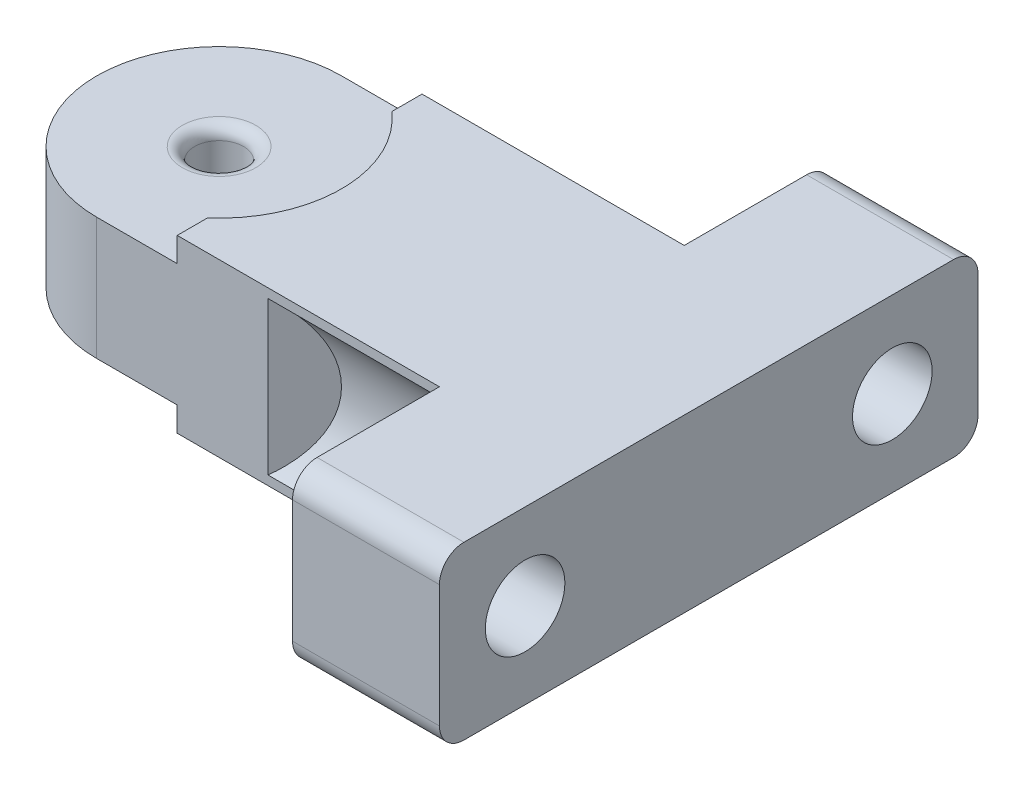
ISO-10303-21;
HEADER;
FILE_DESCRIPTION(('STEP AP214'),'2;1');
FILE_NAME('part.step','',(''),(''),'','','');
FILE_SCHEMA(('AUTOMOTIVE_DESIGN { 1 0 10303 214 1 1 1 1 }'));
ENDSEC;
DATA;
#1=APPLICATION_CONTEXT('core data for automotive mechanical design processes');
#2=APPLICATION_PROTOCOL_DEFINITION('international standard','automotive_design',2000,#1);
#3=PRODUCT_CONTEXT('',#1,'mechanical');
#4=PRODUCT('Part','Part','',(#3));
#5=PRODUCT_RELATED_PRODUCT_CATEGORY('part','',(#4));
#6=PRODUCT_DEFINITION_FORMATION('','',#4);
#7=PRODUCT_DEFINITION_CONTEXT('part definition',#1,'design');
#8=PRODUCT_DEFINITION('design','',#6,#7);
#9=PRODUCT_DEFINITION_SHAPE('','',#8);
#10=(LENGTH_UNIT() NAMED_UNIT(*) SI_UNIT(.MILLI.,.METRE.));
#11=(NAMED_UNIT(*) PLANE_ANGLE_UNIT() SI_UNIT($,.RADIAN.));
#12=(NAMED_UNIT(*) SI_UNIT($,.STERADIAN.) SOLID_ANGLE_UNIT());
#13=UNCERTAINTY_MEASURE_WITH_UNIT(LENGTH_MEASURE(1.E-05),#10,'distance_accuracy_value','');
#14=(GEOMETRIC_REPRESENTATION_CONTEXT(3) GLOBAL_UNCERTAINTY_ASSIGNED_CONTEXT((#13)) GLOBAL_UNIT_ASSIGNED_CONTEXT((#10,
#11,#12)) REPRESENTATION_CONTEXT('',''));
#15=CARTESIAN_POINT('',(0.,0.,0.));
#16=DIRECTION('',(0.,0.,1.));
#17=DIRECTION('',(1.,0.,0.));
#18=AXIS2_PLACEMENT_3D('',#15,#16,#17);
#19=CARTESIAN_POINT('',(25.,10.,10.));
#20=DIRECTION('',(0.,0.,-1.));
#21=DIRECTION('',(-1.,0.,0.));
#22=AXIS2_PLACEMENT_3D('',#19,#20,#21);
#23=PLANE('',#22);
#24=DIRECTION('',(0.,1.,0.));
#25=VECTOR('',#24,1.);
#26=CARTESIAN_POINT('',(-1.00000000000007,10.,10.));
#27=LINE('',#26,#25);
#28=CARTESIAN_POINT('',(-1.00000000000007,-1.2449979983984,10.));
#29=VERTEX_POINT('',#28);
#30=CARTESIAN_POINT('',(-1.00000000000007,11.2449979983984,10.));
#31=VERTEX_POINT('',#30);
#32=EDGE_CURVE('E418',#29,#31,#27,.T.);
#33=ORIENTED_EDGE('',*,*,#32,.T.);
#34=DIRECTION('',(1.,0.,0.));
#35=VECTOR('',#34,1.);
#36=CARTESIAN_POINT('',(3.,11.2449979983984,10.));
#37=LINE('',#36,#35);
#38=CARTESIAN_POINT('',(13.,11.2449979983984,10.));
#39=VERTEX_POINT('',#38);
#40=EDGE_CURVE('E271',#39,#31,#37,.F.);
#41=ORIENTED_EDGE('',*,*,#40,.F.);
#42=DIRECTION('',(0.,1.,0.));
#43=VECTOR('',#42,1.);
#44=CARTESIAN_POINT('',(13.,-2.,10.));
#45=LINE('',#44,#43);
#46=CARTESIAN_POINT('',(13.,12.,10.));
#47=VERTEX_POINT('',#46);
#48=EDGE_CURVE('E301',#39,#47,#45,.T.);
#49=ORIENTED_EDGE('',*,*,#48,.T.);
#50=DIRECTION('',(1.,0.,0.));
#51=VECTOR('',#50,1.);
#52=CARTESIAN_POINT('',(25.,12.,10.));
#53=LINE('',#52,#51);
#54=CARTESIAN_POINT('',(-8.42023376202405,12.,10.));
#55=VERTEX_POINT('',#54);
#56=EDGE_CURVE('E355',#55,#47,#53,.T.);
#57=ORIENTED_EDGE('',*,*,#56,.F.);
#58=DIRECTION('',(0.,-1.,0.));
#59=VECTOR('',#58,1.);
#60=CARTESIAN_POINT('',(-8.42023376202405,12.,10.));
#61=LINE('',#60,#59);
#62=CARTESIAN_POINT('',(-8.42023376202405,10.,10.));
#63=VERTEX_POINT('',#62);
#64=EDGE_CURVE('E361',#55,#63,#61,.T.);
#65=ORIENTED_EDGE('',*,*,#64,.T.);
#66=DIRECTION('',(1.,0.,0.));
#67=VECTOR('',#66,1.);
#68=CARTESIAN_POINT('',(25.,10.,10.));
#69=LINE('',#68,#67);
#70=CARTESIAN_POINT('',(-15.,10.,10.));
#71=VERTEX_POINT('',#70);
#72=EDGE_CURVE('E381',#71,#63,#69,.T.);
#73=ORIENTED_EDGE('',*,*,#72,.F.);
#74=DIRECTION('',(0.,-1.,0.));
#75=VECTOR('',#74,1.);
#76=CARTESIAN_POINT('',(-15.,10.,10.));
#77=LINE('',#76,#75);
#78=CARTESIAN_POINT('',(-15.,0.,10.));
#79=VERTEX_POINT('',#78);
#80=EDGE_CURVE('E386',#71,#79,#77,.T.);
#81=ORIENTED_EDGE('',*,*,#80,.T.);
#82=DIRECTION('',(1.,0.,0.));
#83=VECTOR('',#82,1.);
#84=CARTESIAN_POINT('',(25.,0.,10.));
#85=LINE('',#84,#83);
#86=CARTESIAN_POINT('',(-8.42023376202405,0.,10.));
#87=VERTEX_POINT('',#86);
#88=EDGE_CURVE('E387',#79,#87,#85,.T.);
#89=ORIENTED_EDGE('',*,*,#88,.T.);
#90=DIRECTION('',(0.,1.,0.));
#91=VECTOR('',#90,1.);
#92=CARTESIAN_POINT('',(-8.42023376202405,-2.,10.));
#93=LINE('',#92,#91);
#94=CARTESIAN_POINT('',(-8.42023376202405,-2.,10.));
#95=VERTEX_POINT('',#94);
#96=EDGE_CURVE('E343',#95,#87,#93,.T.);
#97=ORIENTED_EDGE('',*,*,#96,.F.);
#98=DIRECTION('',(1.,0.,0.));
#99=VECTOR('',#98,1.);
#100=CARTESIAN_POINT('',(25.,-2.,10.));
#101=LINE('',#100,#99);
#102=CARTESIAN_POINT('',(13.,-2.,10.));
#103=VERTEX_POINT('',#102);
#104=EDGE_CURVE('E318',#95,#103,#101,.T.);
#105=ORIENTED_EDGE('',*,*,#104,.T.);
#106=CARTESIAN_POINT('',(13.,-1.2449979983984,10.));
#107=VERTEX_POINT('',#106);
#108=EDGE_CURVE('E297',#103,#107,#45,.T.);
#109=ORIENTED_EDGE('',*,*,#108,.T.);
#110=DIRECTION('',(1.,0.,0.));
#111=VECTOR('',#110,1.);
#112=CARTESIAN_POINT('',(3.,-1.2449979983984,10.));
#113=LINE('',#112,#111);
#114=EDGE_CURVE('E268',#29,#107,#113,.T.);
#115=ORIENTED_EDGE('',*,*,#114,.F.);
#116=EDGE_LOOP('',(#33,#41,#49,#57,#65,#73,#81,#89,#97,#105,#109,#115));
#117=FACE_BOUND('',#116,.T.);
#118=ADVANCED_FACE('F37',(#117),#23,.F.);
#119=CARTESIAN_POINT('',(25.,10.,10.));
#120=DIRECTION('',(-1.,0.,0.));
#121=DIRECTION('',(0.,0.,1.));
#122=AXIS2_PLACEMENT_3D('',#119,#120,#121);
#123=PLANE('',#122);
#124=CARTESIAN_POINT('',(25.,5.,15.));
#125=DIRECTION('',(1.,0.,0.));
#126=DIRECTION('',(0.,0.,-1.));
#127=AXIS2_PLACEMENT_3D('',#124,#125,#126);
#128=CIRCLE('',#127,3.25);
#129=CARTESIAN_POINT('',(25.,5.,11.75));
#130=VERTEX_POINT('',#129);
#131=EDGE_CURVE('E274',#130,#130,#128,.T.);
#132=ORIENTED_EDGE('',*,*,#131,.F.);
#133=EDGE_LOOP('',(#132));
#134=FACE_BOUND('',#133,.T.);
#135=CARTESIAN_POINT('',(25.,5.,-15.));
#136=DIRECTION('',(1.,0.,0.));
#137=DIRECTION('',(0.,0.,-1.));
#138=AXIS2_PLACEMENT_3D('',#135,#136,#137);
#139=CIRCLE('',#138,3.25);
#140=CARTESIAN_POINT('',(25.,5.,-18.25));
#141=VERTEX_POINT('',#140);
#142=EDGE_CURVE('E273',#141,#141,#139,.T.);
#143=ORIENTED_EDGE('',*,*,#142,.F.);
#144=EDGE_LOOP('',(#143));
#145=FACE_BOUND('',#144,.T.);
#146=DIRECTION('',(0.,0.,-1.));
#147=VECTOR('',#146,1.);
#148=CARTESIAN_POINT('',(25.,-2.,-10.));
#149=LINE('',#148,#147);
#150=CARTESIAN_POINT('',(25.,-2.,20.));
#151=VERTEX_POINT('',#150);
#152=CARTESIAN_POINT('',(25.,-2.,-20.));
#153=VERTEX_POINT('',#152);
#154=EDGE_CURVE('E314',#151,#153,#149,.T.);
#155=ORIENTED_EDGE('',*,*,#154,.T.);
#156=CARTESIAN_POINT('',(25.,0.,-20.));
#157=DIRECTION('',(-1.,0.,0.));
#158=DIRECTION('',(0.,0.,1.));
#159=AXIS2_PLACEMENT_3D('',#156,#157,#158);
#160=CIRCLE('',#159,2.);
#161=CARTESIAN_POINT('',(25.,0.,-22.));
#162=VERTEX_POINT('',#161);
#163=EDGE_CURVE('E445',#153,#162,#160,.F.);
#164=ORIENTED_EDGE('',*,*,#163,.T.);
#165=DIRECTION('',(0.,1.,0.));
#166=VECTOR('',#165,1.);
#167=CARTESIAN_POINT('',(25.,-2.,-22.));
#168=LINE('',#167,#166);
#169=CARTESIAN_POINT('',(25.,10.,-22.));
#170=VERTEX_POINT('',#169);
#171=EDGE_CURVE('E293',#162,#170,#168,.T.);
#172=ORIENTED_EDGE('',*,*,#171,.T.);
#173=CARTESIAN_POINT('',(25.,10.,-20.));
#174=DIRECTION('',(-1.,0.,0.));
#175=DIRECTION('',(0.,0.,1.));
#176=AXIS2_PLACEMENT_3D('',#173,#174,#175);
#177=CIRCLE('',#176,2.);
#178=CARTESIAN_POINT('',(25.,12.,-20.));
#179=VERTEX_POINT('',#178);
#180=EDGE_CURVE('E443',#170,#179,#177,.F.);
#181=ORIENTED_EDGE('',*,*,#180,.T.);
#182=DIRECTION('',(0.,0.,-1.));
#183=VECTOR('',#182,1.);
#184=CARTESIAN_POINT('',(25.,12.,-10.));
#185=LINE('',#184,#183);
#186=CARTESIAN_POINT('',(25.,12.,20.));
#187=VERTEX_POINT('',#186);
#188=EDGE_CURVE('E358',#187,#179,#185,.T.);
#189=ORIENTED_EDGE('',*,*,#188,.F.);
#190=CARTESIAN_POINT('',(25.,10.,20.));
#191=DIRECTION('',(-1.,0.,0.));
#192=DIRECTION('',(0.,0.,1.));
#193=AXIS2_PLACEMENT_3D('',#190,#191,#192);
#194=CIRCLE('',#193,2.);
#195=CARTESIAN_POINT('',(25.,10.,22.));
#196=VERTEX_POINT('',#195);
#197=EDGE_CURVE('E439',#187,#196,#194,.F.);
#198=ORIENTED_EDGE('',*,*,#197,.T.);
#199=DIRECTION('',(0.,-1.,0.));
#200=VECTOR('',#199,1.);
#201=CARTESIAN_POINT('',(25.,-2.,22.));
#202=LINE('',#201,#200);
#203=CARTESIAN_POINT('',(25.,0.,22.));
#204=VERTEX_POINT('',#203);
#205=EDGE_CURVE('E292',#196,#204,#202,.T.);
#206=ORIENTED_EDGE('',*,*,#205,.T.);
#207=CARTESIAN_POINT('',(25.,0.,20.));
#208=DIRECTION('',(-1.,0.,0.));
#209=DIRECTION('',(0.,0.,1.));
#210=AXIS2_PLACEMENT_3D('',#207,#208,#209);
#211=CIRCLE('',#210,2.);
#212=EDGE_CURVE('E441',#204,#151,#211,.F.);
#213=ORIENTED_EDGE('',*,*,#212,.T.);
#214=EDGE_LOOP('',(#155,#164,#172,#181,#189,#198,#206,#213));
#215=FACE_BOUND('',#214,.T.);
#216=ADVANCED_FACE('F482',(#134,#145,#215),#123,.F.);
#217=CARTESIAN_POINT('',(25.,10.,-10.));
#218=DIRECTION('',(0.,0.,1.));
#219=DIRECTION('',(1.,0.,0.));
#220=AXIS2_PLACEMENT_3D('',#217,#218,#219);
#221=PLANE('',#220);
#222=DIRECTION('',(0.,-1.,0.));
#223=VECTOR('',#222,1.);
#224=CARTESIAN_POINT('',(-1.00000000000007,10.,-10.));
#225=LINE('',#224,#223);
#226=CARTESIAN_POINT('',(-1.00000000000007,11.2449979983984,-10.));
#227=VERTEX_POINT('',#226);
#228=CARTESIAN_POINT('',(-1.00000000000007,-1.2449979983984,-10.));
#229=VERTEX_POINT('',#228);
#230=EDGE_CURVE('E425',#227,#229,#225,.T.);
#231=ORIENTED_EDGE('',*,*,#230,.T.);
#232=DIRECTION('',(1.,0.,0.));
#233=VECTOR('',#232,1.);
#234=CARTESIAN_POINT('',(3.,-1.2449979983984,-10.));
#235=LINE('',#234,#233);
#236=CARTESIAN_POINT('',(13.,-1.2449979983984,-10.));
#237=VERTEX_POINT('',#236);
#238=EDGE_CURVE('E263',#229,#237,#235,.T.);
#239=ORIENTED_EDGE('',*,*,#238,.T.);
#240=DIRECTION('',(0.,-1.,0.));
#241=VECTOR('',#240,1.);
#242=CARTESIAN_POINT('',(13.,-2.,-10.));
#243=LINE('',#242,#241);
#244=CARTESIAN_POINT('',(13.,-2.,-10.));
#245=VERTEX_POINT('',#244);
#246=EDGE_CURVE('E284',#237,#245,#243,.T.);
#247=ORIENTED_EDGE('',*,*,#246,.T.);
#248=DIRECTION('',(-1.,0.,0.));
#249=VECTOR('',#248,1.);
#250=CARTESIAN_POINT('',(25.,-2.,-10.));
#251=LINE('',#250,#249);
#252=CARTESIAN_POINT('',(-8.42023376202405,-2.,-10.));
#253=VERTEX_POINT('',#252);
#254=EDGE_CURVE('E312',#245,#253,#251,.T.);
#255=ORIENTED_EDGE('',*,*,#254,.T.);
#256=DIRECTION('',(0.,1.,0.));
#257=VECTOR('',#256,1.);
#258=CARTESIAN_POINT('',(-8.42023376202405,-2.,-10.));
#259=LINE('',#258,#257);
#260=CARTESIAN_POINT('',(-8.42023376202405,0.,-10.));
#261=VERTEX_POINT('',#260);
#262=EDGE_CURVE('E330',#253,#261,#259,.T.);
#263=ORIENTED_EDGE('',*,*,#262,.T.);
#264=DIRECTION('',(-1.,0.,0.));
#265=VECTOR('',#264,1.);
#266=CARTESIAN_POINT('',(25.,0.,-10.));
#267=LINE('',#266,#265);
#268=CARTESIAN_POINT('',(-15.,0.,-10.));
#269=VERTEX_POINT('',#268);
#270=EDGE_CURVE('E384',#261,#269,#267,.T.);
#271=ORIENTED_EDGE('',*,*,#270,.T.);
#272=DIRECTION('',(0.,-1.,0.));
#273=VECTOR('',#272,1.);
#274=CARTESIAN_POINT('',(-15.,10.,-10.));
#275=LINE('',#274,#273);
#276=CARTESIAN_POINT('',(-15.,10.,-10.));
#277=VERTEX_POINT('',#276);
#278=EDGE_CURVE('E402',#269,#277,#275,.F.);
#279=ORIENTED_EDGE('',*,*,#278,.T.);
#280=DIRECTION('',(-1.,0.,0.));
#281=VECTOR('',#280,1.);
#282=CARTESIAN_POINT('',(25.,10.,-10.));
#283=LINE('',#282,#281);
#284=CARTESIAN_POINT('',(-8.42023376202405,10.,-10.));
#285=VERTEX_POINT('',#284);
#286=EDGE_CURVE('E383',#285,#277,#283,.T.);
#287=ORIENTED_EDGE('',*,*,#286,.F.);
#288=DIRECTION('',(0.,-1.,0.));
#289=VECTOR('',#288,1.);
#290=CARTESIAN_POINT('',(-8.42023376202405,12.,-10.));
#291=LINE('',#290,#289);
#292=CARTESIAN_POINT('',(-8.42023376202405,12.,-10.));
#293=VERTEX_POINT('',#292);
#294=EDGE_CURVE('E377',#293,#285,#291,.T.);
#295=ORIENTED_EDGE('',*,*,#294,.F.);
#296=DIRECTION('',(-1.,0.,0.));
#297=VECTOR('',#296,1.);
#298=CARTESIAN_POINT('',(25.,12.,-10.));
#299=LINE('',#298,#297);
#300=CARTESIAN_POINT('',(13.,12.,-10.));
#301=VERTEX_POINT('',#300);
#302=EDGE_CURVE('E346',#301,#293,#299,.T.);
#303=ORIENTED_EDGE('',*,*,#302,.F.);
#304=CARTESIAN_POINT('',(13.,11.2449979983984,-10.));
#305=VERTEX_POINT('',#304);
#306=EDGE_CURVE('E280',#301,#305,#243,.T.);
#307=ORIENTED_EDGE('',*,*,#306,.T.);
#308=DIRECTION('',(1.,0.,0.));
#309=VECTOR('',#308,1.);
#310=CARTESIAN_POINT('',(3.,11.2449979983984,-10.));
#311=LINE('',#310,#309);
#312=EDGE_CURVE('E261',#305,#227,#311,.F.);
#313=ORIENTED_EDGE('',*,*,#312,.T.);
#314=EDGE_LOOP('',(#231,#239,#247,#255,#263,#271,#279,#287,#295,#303,#307,#313));
#315=FACE_BOUND('',#314,.T.);
#316=ADVANCED_FACE('F518',(#315),#221,.F.);
#317=CARTESIAN_POINT('',(0.,10.,0.));
#318=DIRECTION('',(0.,1.,0.));
#319=DIRECTION('',(0.,0.,1.));
#320=AXIS2_PLACEMENT_3D('',#317,#318,#319);
#321=PLANE('',#320);
#322=CARTESIAN_POINT('',(-15.,10.,0.));
#323=DIRECTION('',(0.,1.,0.));
#324=DIRECTION('',(0.,0.,1.));
#325=AXIS2_PLACEMENT_3D('',#322,#323,#324);
#326=CIRCLE('',#325,3.);
#327=CARTESIAN_POINT('',(-15.,10.,3.));
#328=VERTEX_POINT('',#327);
#329=EDGE_CURVE('E413',#328,#328,#326,.F.);
#330=ORIENTED_EDGE('',*,*,#329,.T.);
#331=EDGE_LOOP('',(#330));
#332=FACE_BOUND('',#331,.T.);
#333=DIRECTION('',(0.,0.,1.));
#334=VECTOR('',#333,1.);
#335=CARTESIAN_POINT('',(-8.42023376202405,10.,7.53038353960751));
#336=LINE('',#335,#334);
#337=CARTESIAN_POINT('',(-8.42023376202405,10.,7.53038353960751));
#338=VERTEX_POINT('',#337);
#339=EDGE_CURVE('E349',#338,#63,#336,.T.);
#340=ORIENTED_EDGE('',*,*,#339,.F.);
#341=CARTESIAN_POINT('',(-15.,10.,0.));
#342=DIRECTION('',(0.,-1.,0.));
#343=DIRECTION('',(0.,0.,1.));
#344=AXIS2_PLACEMENT_3D('',#341,#342,#343);
#345=CIRCLE('',#344,10.);
#346=CARTESIAN_POINT('',(-8.42023376202405,10.,-7.53038353960751));
#347=VERTEX_POINT('',#346);
#348=EDGE_CURVE('E364',#347,#338,#345,.T.);
#349=ORIENTED_EDGE('',*,*,#348,.F.);
#350=DIRECTION('',(0.,0.,1.));
#351=VECTOR('',#350,1.);
#352=CARTESIAN_POINT('',(-8.42023376202405,10.,-10.));
#353=LINE('',#352,#351);
#354=EDGE_CURVE('E345',#285,#347,#353,.T.);
#355=ORIENTED_EDGE('',*,*,#354,.F.);
#356=ORIENTED_EDGE('',*,*,#286,.T.);
#357=CARTESIAN_POINT('',(-15.,10.,0.));
#358=DIRECTION('',(0.,1.,0.));
#359=DIRECTION('',(0.,0.,1.));
#360=AXIS2_PLACEMENT_3D('',#357,#358,#359);
#361=CIRCLE('',#360,10.);
#362=CARTESIAN_POINT('',(-25.,10.,0.));
#363=VERTEX_POINT('',#362);
#364=EDGE_CURVE('E398',#277,#363,#361,.T.);
#365=ORIENTED_EDGE('',*,*,#364,.T.);
#366=CARTESIAN_POINT('',(-15.,10.,0.));
#367=DIRECTION('',(0.,1.,0.));
#368=DIRECTION('',(0.,0.,1.));
#369=AXIS2_PLACEMENT_3D('',#366,#367,#368);
#370=CIRCLE('',#369,10.);
#371=EDGE_CURVE('E400',#363,#71,#370,.T.);
#372=ORIENTED_EDGE('',*,*,#371,.T.);
#373=ORIENTED_EDGE('',*,*,#72,.T.);
#374=EDGE_LOOP('',(#340,#349,#355,#356,#365,#372,#373));
#375=FACE_BOUND('',#374,.T.);
#376=ADVANCED_FACE('F621',(#332,#375),#321,.T.);
#377=CARTESIAN_POINT('',(0.,0.,0.));
#378=DIRECTION('',(0.,1.,0.));
#379=DIRECTION('',(0.,0.,1.));
#380=AXIS2_PLACEMENT_3D('',#377,#378,#379);
#381=PLANE('',#380);
#382=CARTESIAN_POINT('',(-15.,0.,0.));
#383=DIRECTION('',(0.,1.,0.));
#384=DIRECTION('',(0.,0.,1.));
#385=AXIS2_PLACEMENT_3D('',#382,#383,#384);
#386=CIRCLE('',#385,3.);
#387=CARTESIAN_POINT('',(-18.,0.,0.));
#388=VERTEX_POINT('',#387);
#389=CARTESIAN_POINT('',(-17.883785087815,0.,-0.826912067451));
#390=VERTEX_POINT('',#389);
#391=EDGE_CURVE('E57',#388,#390,#386,.T.);
#392=ORIENTED_EDGE('',*,*,#391,.T.);
#393=DIRECTION('',(-0.961261695938319,0.,-0.275637355817));
#394=VECTOR('',#393,1.);
#395=CARTESIAN_POINT('',(-1.13963927882681,0.,3.97439448174905));
#396=LINE('',#395,#394);
#397=CARTESIAN_POINT('',(-24.6126169593832,0.,-2.75637355817));
#398=VERTEX_POINT('',#397);
#399=EDGE_CURVE('E52',#390,#398,#396,.T.);
#400=ORIENTED_EDGE('',*,*,#399,.T.);
#401=CARTESIAN_POINT('',(-15.,0.,0.));
#402=DIRECTION('',(0.,1.,0.));
#403=DIRECTION('',(0.,0.,1.));
#404=AXIS2_PLACEMENT_3D('',#401,#402,#403);
#405=CIRCLE('',#404,10.);
#406=EDGE_CURVE('E394',#398,#269,#405,.F.);
#407=ORIENTED_EDGE('',*,*,#406,.T.);
#408=ORIENTED_EDGE('',*,*,#270,.F.);
#409=DIRECTION('',(0.,0.,1.));
#410=VECTOR('',#409,1.);
#411=CARTESIAN_POINT('',(-8.42023376202405,0.,-10.));
#412=LINE('',#411,#410);
#413=CARTESIAN_POINT('',(-8.42023376202405,0.,-7.53038353960751));
#414=VERTEX_POINT('',#413);
#415=EDGE_CURVE('E315',#261,#414,#412,.T.);
#416=ORIENTED_EDGE('',*,*,#415,.T.);
#417=CARTESIAN_POINT('',(-15.,0.,0.));
#418=DIRECTION('',(0.,-1.,0.));
#419=DIRECTION('',(0.,0.,1.));
#420=AXIS2_PLACEMENT_3D('',#417,#418,#419);
#421=CIRCLE('',#420,10.);
#422=CARTESIAN_POINT('',(-8.42023376202405,0.,7.53038353960751));
#423=VERTEX_POINT('',#422);
#424=EDGE_CURVE('E333',#414,#423,#421,.T.);
#425=ORIENTED_EDGE('',*,*,#424,.T.);
#426=DIRECTION('',(0.,0.,1.));
#427=VECTOR('',#426,1.);
#428=CARTESIAN_POINT('',(-8.42023376202405,0.,7.53038353960751));
#429=LINE('',#428,#427);
#430=EDGE_CURVE('E309',#423,#87,#429,.T.);
#431=ORIENTED_EDGE('',*,*,#430,.T.);
#432=ORIENTED_EDGE('',*,*,#88,.F.);
#433=CARTESIAN_POINT('',(-15.,0.,0.));
#434=DIRECTION('',(0.,1.,0.));
#435=DIRECTION('',(0.,0.,1.));
#436=AXIS2_PLACEMENT_3D('',#433,#434,#435);
#437=CIRCLE('',#436,10.);
#438=CARTESIAN_POINT('',(-25.,0.,0.));
#439=VERTEX_POINT('',#438);
#440=EDGE_CURVE('E396',#79,#439,#437,.F.);
#441=ORIENTED_EDGE('',*,*,#440,.T.);
#442=DIRECTION('',(-1.,0.,0.));
#443=VECTOR('',#442,1.);
#444=CARTESIAN_POINT('',(0.,0.,0.));
#445=LINE('',#444,#443);
#446=EDGE_CURVE('E246',#388,#439,#445,.T.);
#447=ORIENTED_EDGE('',*,*,#446,.F.);
#448=EDGE_LOOP('',(#392,#400,#407,#408,#416,#425,#431,#432,#441,#447));
#449=FACE_BOUND('',#448,.T.);
#450=ADVANCED_FACE('F591',(#449),#381,.F.);
#451=CARTESIAN_POINT('',(-15.,10.,0.));
#452=DIRECTION('',(0.,-1.,0.));
#453=DIRECTION('',(0.,0.,-1.));
#454=AXIS2_PLACEMENT_3D('',#451,#452,#453);
#455=CYLINDRICAL_SURFACE('',#454,10.);
#456=DIRECTION('',(0.,-1.,0.));
#457=VECTOR('',#456,1.);
#458=CARTESIAN_POINT('',(-25.,10.,0.));
#459=LINE('',#458,#457);
#460=EDGE_CURVE('E380',#363,#439,#459,.T.);
#461=ORIENTED_EDGE('',*,*,#460,.F.);
#462=ORIENTED_EDGE('',*,*,#364,.F.);
#463=ORIENTED_EDGE('',*,*,#278,.F.);
#464=ORIENTED_EDGE('',*,*,#406,.F.);
#465=DIRECTION('',(0.,1.,0.));
#466=VECTOR('',#465,1.);
#467=CARTESIAN_POINT('',(-24.6126169593832,-1.,-2.75637355817));
#468=LINE('',#467,#466);
#469=CARTESIAN_POINT('',(-24.6126169593832,-1.,-2.75637355817));
#470=VERTEX_POINT('',#469);
#471=EDGE_CURVE('E253',#470,#398,#468,.T.);
#472=ORIENTED_EDGE('',*,*,#471,.F.);
#473=CARTESIAN_POINT('',(-15.,-1.,0.));
#474=DIRECTION('',(0.,-1.,0.));
#475=DIRECTION('',(0.,0.,-1.));
#476=AXIS2_PLACEMENT_3D('',#473,#474,#475);
#477=CIRCLE('',#476,10.);
#478=CARTESIAN_POINT('',(-25.,-1.,0.));
#479=VERTEX_POINT('',#478);
#480=EDGE_CURVE('E244',#479,#470,#477,.T.);
#481=ORIENTED_EDGE('',*,*,#480,.F.);
#482=DIRECTION('',(0.,1.,0.));
#483=VECTOR('',#482,1.);
#484=CARTESIAN_POINT('',(-25.,-1.,0.));
#485=LINE('',#484,#483);
#486=EDGE_CURVE('E256',#479,#439,#485,.T.);
#487=ORIENTED_EDGE('',*,*,#486,.T.);
#488=EDGE_LOOP('',(#461,#462,#463,#464,#472,#481,#487));
#489=FACE_BOUND('',#488,.T.);
#490=ADVANCED_FACE('F587',(#489),#455,.T.);
#491=CARTESIAN_POINT('',(-15.,10.,0.));
#492=DIRECTION('',(0.,-1.,0.));
#493=DIRECTION('',(0.,0.,-1.));
#494=AXIS2_PLACEMENT_3D('',#491,#492,#493);
#495=CYLINDRICAL_SURFACE('',#494,10.);
#496=ORIENTED_EDGE('',*,*,#371,.F.);
#497=ORIENTED_EDGE('',*,*,#460,.T.);
#498=ORIENTED_EDGE('',*,*,#440,.F.);
#499=ORIENTED_EDGE('',*,*,#80,.F.);
#500=EDGE_LOOP('',(#496,#497,#498,#499));
#501=FACE_BOUND('',#500,.T.);
#502=ADVANCED_FACE('F583',(#501),#495,.T.);
#503=CARTESIAN_POINT('',(-15.,0.,0.));
#504=DIRECTION('',(0.,1.,0.));
#505=DIRECTION('',(0.,0.,1.));
#506=AXIS2_PLACEMENT_3D('',#503,#504,#505);
#507=CYLINDRICAL_SURFACE('',#506,2.);
#508=CARTESIAN_POINT('',(-15.,9.,0.));
#509=DIRECTION('',(0.,1.,0.));
#510=DIRECTION('',(0.,0.,1.));
#511=AXIS2_PLACEMENT_3D('',#508,#509,#510);
#512=CIRCLE('',#511,2.);
#513=CARTESIAN_POINT('',(-15.,9.,2.));
#514=VERTEX_POINT('',#513);
#515=EDGE_CURVE('E410',#514,#514,#512,.T.);
#516=ORIENTED_EDGE('',*,*,#515,.T.);
#517=EDGE_LOOP('',(#516));
#518=FACE_BOUND('',#517,.T.);
#519=CARTESIAN_POINT('',(-15.,1.,0.));
#520=DIRECTION('',(0.,1.,0.));
#521=DIRECTION('',(0.,0.,1.));
#522=AXIS2_PLACEMENT_3D('',#519,#520,#521);
#523=CIRCLE('',#522,2.);
#524=CARTESIAN_POINT('',(-15.,1.,2.));
#525=VERTEX_POINT('',#524);
#526=EDGE_CURVE('E405',#525,#525,#523,.F.);
#527=ORIENTED_EDGE('',*,*,#526,.T.);
#528=EDGE_LOOP('',(#527));
#529=FACE_BOUND('',#528,.T.);
#530=ADVANCED_FACE('F586',(#518,#529),#507,.F.);
#531=CARTESIAN_POINT('',(-8.42023376202405,12.,-10.));
#532=DIRECTION('',(1.,0.,0.));
#533=DIRECTION('',(0.,0.,-1.));
#534=AXIS2_PLACEMENT_3D('',#531,#532,#533);
#535=PLANE('',#534);
#536=ORIENTED_EDGE('',*,*,#354,.T.);
#537=DIRECTION('',(0.,-1.,0.));
#538=VECTOR('',#537,1.);
#539=CARTESIAN_POINT('',(-8.42023376202405,12.,-7.53038353960751));
#540=LINE('',#539,#538);
#541=CARTESIAN_POINT('',(-8.42023376202405,12.,-7.53038353960751));
#542=VERTEX_POINT('',#541);
#543=EDGE_CURVE('E374',#542,#347,#540,.T.);
#544=ORIENTED_EDGE('',*,*,#543,.F.);
#545=DIRECTION('',(0.,0.,1.));
#546=VECTOR('',#545,1.);
#547=CARTESIAN_POINT('',(-8.42023376202405,12.,-10.));
#548=LINE('',#547,#546);
#549=EDGE_CURVE('E348',#293,#542,#548,.T.);
#550=ORIENTED_EDGE('',*,*,#549,.F.);
#551=ORIENTED_EDGE('',*,*,#294,.T.);
#552=EDGE_LOOP('',(#536,#544,#550,#551));
#553=FACE_BOUND('',#552,.T.);
#554=ADVANCED_FACE('F524',(#553),#535,.F.);
#555=CARTESIAN_POINT('',(-15.,12.,0.));
#556=DIRECTION('',(0.,-1.,0.));
#557=DIRECTION('',(0.,0.,-1.));
#558=AXIS2_PLACEMENT_3D('',#555,#556,#557);
#559=CYLINDRICAL_SURFACE('',#558,10.);
#560=ORIENTED_EDGE('',*,*,#348,.T.);
#561=DIRECTION('',(0.,-1.,0.));
#562=VECTOR('',#561,1.);
#563=CARTESIAN_POINT('',(-8.42023376202405,12.,7.53038353960751));
#564=LINE('',#563,#562);
#565=CARTESIAN_POINT('',(-8.42023376202405,12.,7.53038353960751));
#566=VERTEX_POINT('',#565);
#567=EDGE_CURVE('E371',#566,#338,#564,.T.);
#568=ORIENTED_EDGE('',*,*,#567,.F.);
#569=CARTESIAN_POINT('',(-15.,12.,0.));
#570=DIRECTION('',(0.,-1.,0.));
#571=DIRECTION('',(0.,0.,1.));
#572=AXIS2_PLACEMENT_3D('',#569,#570,#571);
#573=CIRCLE('',#572,10.);
#574=EDGE_CURVE('E351',#542,#566,#573,.T.);
#575=ORIENTED_EDGE('',*,*,#574,.F.);
#576=ORIENTED_EDGE('',*,*,#543,.T.);
#577=EDGE_LOOP('',(#560,#568,#575,#576));
#578=FACE_BOUND('',#577,.T.);
#579=ADVANCED_FACE('F528',(#578),#559,.F.);
#580=CARTESIAN_POINT('',(-8.42023376202405,12.,7.53038353960751));
#581=DIRECTION('',(1.,0.,0.));
#582=DIRECTION('',(0.,0.,-1.));
#583=AXIS2_PLACEMENT_3D('',#580,#581,#582);
#584=PLANE('',#583);
#585=ORIENTED_EDGE('',*,*,#339,.T.);
#586=ORIENTED_EDGE('',*,*,#64,.F.);
#587=DIRECTION('',(0.,0.,1.));
#588=VECTOR('',#587,1.);
#589=CARTESIAN_POINT('',(-8.42023376202405,12.,7.53038353960751));
#590=LINE('',#589,#588);
#591=EDGE_CURVE('E353',#566,#55,#590,.T.);
#592=ORIENTED_EDGE('',*,*,#591,.F.);
#593=ORIENTED_EDGE('',*,*,#567,.T.);
#594=EDGE_LOOP('',(#585,#586,#592,#593));
#595=FACE_BOUND('',#594,.T.);
#596=ADVANCED_FACE('F532',(#595),#584,.F.);
#597=CARTESIAN_POINT('',(-15.,12.,0.));
#598=DIRECTION('',(0.,1.,0.));
#599=DIRECTION('',(0.,0.,1.));
#600=AXIS2_PLACEMENT_3D('',#597,#598,#599);
#601=PLANE('',#600);
#602=ORIENTED_EDGE('',*,*,#188,.T.);
#603=DIRECTION('',(1.,0.,0.));
#604=VECTOR('',#603,1.);
#605=CARTESIAN_POINT('',(-15.,12.,-20.));
#606=LINE('',#605,#604);
#607=CARTESIAN_POINT('',(13.,12.,-20.));
#608=VERTEX_POINT('',#607);
#609=EDGE_CURVE('E459',#179,#608,#606,.F.);
#610=ORIENTED_EDGE('',*,*,#609,.T.);
#611=DIRECTION('',(0.,0.,1.));
#612=VECTOR('',#611,1.);
#613=CARTESIAN_POINT('',(13.,12.,-10.));
#614=LINE('',#613,#612);
#615=EDGE_CURVE('E290',#608,#301,#614,.T.);
#616=ORIENTED_EDGE('',*,*,#615,.T.);
#617=ORIENTED_EDGE('',*,*,#302,.T.);
#618=ORIENTED_EDGE('',*,*,#549,.T.);
#619=ORIENTED_EDGE('',*,*,#574,.T.);
#620=ORIENTED_EDGE('',*,*,#591,.T.);
#621=ORIENTED_EDGE('',*,*,#56,.T.);
#622=DIRECTION('',(0.,0.,1.));
#623=VECTOR('',#622,1.);
#624=CARTESIAN_POINT('',(13.,12.,10.));
#625=LINE('',#624,#623);
#626=CARTESIAN_POINT('',(13.,12.,20.));
#627=VERTEX_POINT('',#626);
#628=EDGE_CURVE('E300',#47,#627,#625,.T.);
#629=ORIENTED_EDGE('',*,*,#628,.T.);
#630=DIRECTION('',(1.,0.,0.));
#631=VECTOR('',#630,1.);
#632=CARTESIAN_POINT('',(-15.,12.,20.));
#633=LINE('',#632,#631);
#634=EDGE_CURVE('E456',#627,#187,#633,.T.);
#635=ORIENTED_EDGE('',*,*,#634,.T.);
#636=EDGE_LOOP('',(#602,#610,#616,#617,#618,#619,#620,#621,#629,#635));
#637=FACE_BOUND('',#636,.T.);
#638=ADVANCED_FACE('F477',(#637),#601,.T.);
#639=CARTESIAN_POINT('',(-8.42023376202405,-2.,7.53038353960751));
#640=DIRECTION('',(-1.,0.,0.));
#641=DIRECTION('',(0.,0.,1.));
#642=AXIS2_PLACEMENT_3D('',#639,#640,#641);
#643=PLANE('',#642);
#644=ORIENTED_EDGE('',*,*,#430,.F.);
#645=DIRECTION('',(0.,1.,0.));
#646=VECTOR('',#645,1.);
#647=CARTESIAN_POINT('',(-8.42023376202405,-2.,7.53038353960751));
#648=LINE('',#647,#646);
#649=CARTESIAN_POINT('',(-8.42023376202405,-2.,7.53038353960751));
#650=VERTEX_POINT('',#649);
#651=EDGE_CURVE('E341',#650,#423,#648,.T.);
#652=ORIENTED_EDGE('',*,*,#651,.F.);
#653=DIRECTION('',(0.,0.,1.));
#654=VECTOR('',#653,1.);
#655=CARTESIAN_POINT('',(-8.42023376202405,-2.,7.53038353960751));
#656=LINE('',#655,#654);
#657=EDGE_CURVE('E321',#650,#95,#656,.T.);
#658=ORIENTED_EDGE('',*,*,#657,.T.);
#659=ORIENTED_EDGE('',*,*,#96,.T.);
#660=EDGE_LOOP('',(#644,#652,#658,#659));
#661=FACE_BOUND('',#660,.T.);
#662=ADVANCED_FACE('F546',(#661),#643,.T.);
#663=CARTESIAN_POINT('',(-15.,-2.,0.));
#664=DIRECTION('',(0.,1.,0.));
#665=DIRECTION('',(0.,0.,1.));
#666=AXIS2_PLACEMENT_3D('',#663,#664,#665);
#667=CYLINDRICAL_SURFACE('',#666,10.);
#668=ORIENTED_EDGE('',*,*,#424,.F.);
#669=DIRECTION('',(0.,1.,0.));
#670=VECTOR('',#669,1.);
#671=CARTESIAN_POINT('',(-8.42023376202405,-2.,-7.53038353960751));
#672=LINE('',#671,#670);
#673=CARTESIAN_POINT('',(-8.42023376202405,-2.,-7.53038353960751));
#674=VERTEX_POINT('',#673);
#675=EDGE_CURVE('E339',#674,#414,#672,.T.);
#676=ORIENTED_EDGE('',*,*,#675,.F.);
#677=CARTESIAN_POINT('',(-15.,-2.,0.));
#678=DIRECTION('',(0.,-1.,0.));
#679=DIRECTION('',(0.,0.,1.));
#680=AXIS2_PLACEMENT_3D('',#677,#678,#679);
#681=CIRCLE('',#680,10.);
#682=EDGE_CURVE('E324',#674,#650,#681,.T.);
#683=ORIENTED_EDGE('',*,*,#682,.T.);
#684=ORIENTED_EDGE('',*,*,#651,.T.);
#685=EDGE_LOOP('',(#668,#676,#683,#684));
#686=FACE_BOUND('',#685,.T.);
#687=ADVANCED_FACE('F549',(#686),#667,.F.);
#688=CARTESIAN_POINT('',(-8.42023376202405,-2.,-10.));
#689=DIRECTION('',(-1.,0.,0.));
#690=DIRECTION('',(0.,0.,1.));
#691=AXIS2_PLACEMENT_3D('',#688,#689,#690);
#692=PLANE('',#691);
#693=ORIENTED_EDGE('',*,*,#415,.F.);
#694=ORIENTED_EDGE('',*,*,#262,.F.);
#695=DIRECTION('',(0.,0.,1.));
#696=VECTOR('',#695,1.);
#697=CARTESIAN_POINT('',(-8.42023376202405,-2.,-10.));
#698=LINE('',#697,#696);
#699=EDGE_CURVE('E327',#253,#674,#698,.T.);
#700=ORIENTED_EDGE('',*,*,#699,.T.);
#701=ORIENTED_EDGE('',*,*,#675,.T.);
#702=EDGE_LOOP('',(#693,#694,#700,#701));
#703=FACE_BOUND('',#702,.T.);
#704=ADVANCED_FACE('F554',(#703),#692,.T.);
#705=CARTESIAN_POINT('',(-15.,-2.,0.));
#706=DIRECTION('',(0.,-1.,0.));
#707=DIRECTION('',(0.,0.,1.));
#708=AXIS2_PLACEMENT_3D('',#705,#706,#707);
#709=PLANE('',#708);
#710=DIRECTION('',(0.,0.,-1.));
#711=VECTOR('',#710,1.);
#712=CARTESIAN_POINT('',(13.,-2.,-10.));
#713=LINE('',#712,#711);
#714=CARTESIAN_POINT('',(13.,-2.,-20.));
#715=VERTEX_POINT('',#714);
#716=EDGE_CURVE('E283',#245,#715,#713,.T.);
#717=ORIENTED_EDGE('',*,*,#716,.T.);
#718=DIRECTION('',(1.,0.,0.));
#719=VECTOR('',#718,1.);
#720=CARTESIAN_POINT('',(-15.,-2.,-20.));
#721=LINE('',#720,#719);
#722=EDGE_CURVE('E436',#715,#153,#721,.T.);
#723=ORIENTED_EDGE('',*,*,#722,.T.);
#724=ORIENTED_EDGE('',*,*,#154,.F.);
#725=DIRECTION('',(1.,0.,0.));
#726=VECTOR('',#725,1.);
#727=CARTESIAN_POINT('',(-15.,-2.,20.));
#728=LINE('',#727,#726);
#729=CARTESIAN_POINT('',(13.,-2.,20.));
#730=VERTEX_POINT('',#729);
#731=EDGE_CURVE('E434',#151,#730,#728,.F.);
#732=ORIENTED_EDGE('',*,*,#731,.T.);
#733=DIRECTION('',(0.,0.,-1.));
#734=VECTOR('',#733,1.);
#735=CARTESIAN_POINT('',(13.,-2.,10.));
#736=LINE('',#735,#734);
#737=EDGE_CURVE('E307',#730,#103,#736,.T.);
#738=ORIENTED_EDGE('',*,*,#737,.T.);
#739=ORIENTED_EDGE('',*,*,#104,.F.);
#740=ORIENTED_EDGE('',*,*,#657,.F.);
#741=ORIENTED_EDGE('',*,*,#682,.F.);
#742=ORIENTED_EDGE('',*,*,#699,.F.);
#743=ORIENTED_EDGE('',*,*,#254,.F.);
#744=EDGE_LOOP('',(#717,#723,#724,#732,#738,#739,#740,#741,#742,#743));
#745=FACE_BOUND('',#744,.T.);
#746=ADVANCED_FACE('F492',(#745),#709,.T.);
#747=CARTESIAN_POINT('',(-15.,9.,0.));
#748=DIRECTION('',(0.,1.,0.));
#749=DIRECTION('',(0.,0.,1.));
#750=AXIS2_PLACEMENT_3D('',#747,#748,#749);
#751=TOROIDAL_SURFACE('',#750,3.,1.);
#752=ORIENTED_EDGE('',*,*,#329,.F.);
#753=EDGE_LOOP('',(#752));
#754=FACE_BOUND('',#753,.T.);
#755=ORIENTED_EDGE('',*,*,#515,.F.);
#756=EDGE_LOOP('',(#755));
#757=FACE_BOUND('',#756,.T.);
#758=ADVANCED_FACE('F593',(#754,#757),#751,.T.);
#759=CARTESIAN_POINT('',(-15.,1.,0.));
#760=DIRECTION('',(0.,1.,0.));
#761=DIRECTION('',(0.,0.,1.));
#762=AXIS2_PLACEMENT_3D('',#759,#760,#761);
#763=TOROIDAL_SURFACE('',#762,3.,1.);
#764=ORIENTED_EDGE('',*,*,#526,.F.);
#765=EDGE_LOOP('',(#764));
#766=FACE_BOUND('',#765,.T.);
#767=EDGE_CURVE('E416',#390,#388,#386,.T.);
#768=ORIENTED_EDGE('',*,*,#767,.F.);
#769=ORIENTED_EDGE('',*,*,#391,.F.);
#770=EDGE_LOOP('',(#768,#769));
#771=FACE_BOUND('',#770,.T.);
#772=ADVANCED_FACE('F596',(#766,#771),#763,.T.);
#773=CARTESIAN_POINT('',(13.,-2.,22.));
#774=DIRECTION('',(0.,0.,1.));
#775=DIRECTION('',(1.,0.,0.));
#776=AXIS2_PLACEMENT_3D('',#773,#774,#775);
#777=PLANE('',#776);
#778=DIRECTION('',(0.,-1.,0.));
#779=VECTOR('',#778,1.);
#780=CARTESIAN_POINT('',(13.,-2.,22.));
#781=LINE('',#780,#779);
#782=CARTESIAN_POINT('',(13.,10.,22.));
#783=VERTEX_POINT('',#782);
#784=CARTESIAN_POINT('',(13.,0.,22.));
#785=VERTEX_POINT('',#784);
#786=EDGE_CURVE('E304',#783,#785,#781,.T.);
#787=ORIENTED_EDGE('',*,*,#786,.T.);
#788=DIRECTION('',(1.,0.,0.));
#789=VECTOR('',#788,1.);
#790=CARTESIAN_POINT('',(13.,0.,22.));
#791=LINE('',#790,#789);
#792=EDGE_CURVE('E463',#785,#204,#791,.T.);
#793=ORIENTED_EDGE('',*,*,#792,.T.);
#794=ORIENTED_EDGE('',*,*,#205,.F.);
#795=DIRECTION('',(1.,0.,0.));
#796=VECTOR('',#795,1.);
#797=CARTESIAN_POINT('',(13.,10.,22.));
#798=LINE('',#797,#796);
#799=EDGE_CURVE('E461',#196,#783,#798,.F.);
#800=ORIENTED_EDGE('',*,*,#799,.T.);
#801=EDGE_LOOP('',(#787,#793,#794,#800));
#802=FACE_BOUND('',#801,.T.);
#803=ADVANCED_FACE('F484',(#802),#777,.T.);
#804=CARTESIAN_POINT('',(13.,0.,0.));
#805=DIRECTION('',(1.,0.,0.));
#806=DIRECTION('',(0.,0.,-1.));
#807=AXIS2_PLACEMENT_3D('',#804,#805,#806);
#808=PLANE('',#807);
#809=ORIENTED_EDGE('',*,*,#737,.F.);
#810=CARTESIAN_POINT('',(13.,0.,20.));
#811=DIRECTION('',(1.,0.,0.));
#812=DIRECTION('',(0.,0.,-1.));
#813=AXIS2_PLACEMENT_3D('',#810,#811,#812);
#814=CIRCLE('',#813,2.);
#815=EDGE_CURVE('E11',#730,#785,#814,.F.);
#816=ORIENTED_EDGE('',*,*,#815,.T.);
#817=ORIENTED_EDGE('',*,*,#786,.F.);
#818=CARTESIAN_POINT('',(13.,10.,20.));
#819=DIRECTION('',(1.,0.,0.));
#820=DIRECTION('',(0.,0.,-1.));
#821=AXIS2_PLACEMENT_3D('',#818,#819,#820);
#822=CIRCLE('',#821,2.);
#823=EDGE_CURVE('E45',#783,#627,#822,.F.);
#824=ORIENTED_EDGE('',*,*,#823,.T.);
#825=ORIENTED_EDGE('',*,*,#628,.F.);
#826=ORIENTED_EDGE('',*,*,#48,.F.);
#827=CARTESIAN_POINT('',(13.,5.,15.));
#828=DIRECTION('',(-1.,0.,0.));
#829=DIRECTION('',(0.,0.,1.));
#830=AXIS2_PLACEMENT_3D('',#827,#828,#829);
#831=CIRCLE('',#830,8.);
#832=EDGE_CURVE('E266',#39,#107,#831,.T.);
#833=ORIENTED_EDGE('',*,*,#832,.T.);
#834=ORIENTED_EDGE('',*,*,#108,.F.);
#835=EDGE_LOOP('',(#809,#816,#817,#824,#825,#826,#833,#834));
#836=FACE_BOUND('',#835,.T.);
#837=CARTESIAN_POINT('',(13.,5.,15.));
#838=DIRECTION('',(1.,0.,0.));
#839=DIRECTION('',(0.,0.,-1.));
#840=AXIS2_PLACEMENT_3D('',#837,#838,#839);
#841=CIRCLE('',#840,3.25);
#842=CARTESIAN_POINT('',(13.,5.,11.75));
#843=VERTEX_POINT('',#842);
#844=EDGE_CURVE('E296',#843,#843,#841,.T.);
#845=ORIENTED_EDGE('',*,*,#844,.T.);
#846=EDGE_LOOP('',(#845));
#847=FACE_BOUND('',#846,.T.);
#848=ADVANCED_FACE('F470',(#836,#847),#808,.F.);
#849=CARTESIAN_POINT('',(13.,-2.,-22.));
#850=DIRECTION('',(0.,0.,-1.));
#851=DIRECTION('',(-1.,0.,0.));
#852=AXIS2_PLACEMENT_3D('',#849,#850,#851);
#853=PLANE('',#852);
#854=ORIENTED_EDGE('',*,*,#171,.F.);
#855=DIRECTION('',(1.,0.,0.));
#856=VECTOR('',#855,1.);
#857=CARTESIAN_POINT('',(13.,0.,-22.));
#858=LINE('',#857,#856);
#859=CARTESIAN_POINT('',(13.,0.,-22.));
#860=VERTEX_POINT('',#859);
#861=EDGE_CURVE('E450',#162,#860,#858,.F.);
#862=ORIENTED_EDGE('',*,*,#861,.T.);
#863=DIRECTION('',(0.,1.,0.));
#864=VECTOR('',#863,1.);
#865=CARTESIAN_POINT('',(13.,-2.,-22.));
#866=LINE('',#865,#864);
#867=CARTESIAN_POINT('',(13.,10.,-22.));
#868=VERTEX_POINT('',#867);
#869=EDGE_CURVE('E287',#860,#868,#866,.T.);
#870=ORIENTED_EDGE('',*,*,#869,.T.);
#871=DIRECTION('',(1.,0.,0.));
#872=VECTOR('',#871,1.);
#873=CARTESIAN_POINT('',(13.,10.,-22.));
#874=LINE('',#873,#872);
#875=EDGE_CURVE('E447',#868,#170,#874,.T.);
#876=ORIENTED_EDGE('',*,*,#875,.T.);
#877=EDGE_LOOP('',(#854,#862,#870,#876));
#878=FACE_BOUND('',#877,.T.);
#879=ADVANCED_FACE('F502',(#878),#853,.T.);
#880=CARTESIAN_POINT('',(13.,0.,0.));
#881=DIRECTION('',(-1.,0.,0.));
#882=DIRECTION('',(0.,0.,1.));
#883=AXIS2_PLACEMENT_3D('',#880,#881,#882);
#884=PLANE('',#883);
#885=ORIENTED_EDGE('',*,*,#869,.F.);
#886=CARTESIAN_POINT('',(13.,0.,-20.));
#887=DIRECTION('',(-1.,0.,0.));
#888=DIRECTION('',(0.,0.,1.));
#889=AXIS2_PLACEMENT_3D('',#886,#887,#888);
#890=CIRCLE('',#889,2.);
#891=EDGE_CURVE('E454',#860,#715,#890,.T.);
#892=ORIENTED_EDGE('',*,*,#891,.T.);
#893=ORIENTED_EDGE('',*,*,#716,.F.);
#894=ORIENTED_EDGE('',*,*,#246,.F.);
#895=CARTESIAN_POINT('',(13.,5.,-15.));
#896=DIRECTION('',(1.,0.,0.));
#897=DIRECTION('',(0.,0.,-1.));
#898=AXIS2_PLACEMENT_3D('',#895,#896,#897);
#899=CIRCLE('',#898,8.);
#900=EDGE_CURVE('E231',#305,#237,#899,.T.);
#901=ORIENTED_EDGE('',*,*,#900,.F.);
#902=ORIENTED_EDGE('',*,*,#306,.F.);
#903=ORIENTED_EDGE('',*,*,#615,.F.);
#904=CARTESIAN_POINT('',(13.,10.,-20.));
#905=DIRECTION('',(-1.,0.,0.));
#906=DIRECTION('',(0.,0.,1.));
#907=AXIS2_PLACEMENT_3D('',#904,#905,#906);
#908=CIRCLE('',#907,2.);
#909=EDGE_CURVE('E452',#608,#868,#908,.T.);
#910=ORIENTED_EDGE('',*,*,#909,.T.);
#911=EDGE_LOOP('',(#885,#892,#893,#894,#901,#902,#903,#910));
#912=FACE_BOUND('',#911,.T.);
#913=CARTESIAN_POINT('',(13.,5.,-15.));
#914=DIRECTION('',(-1.,0.,0.));
#915=DIRECTION('',(0.,0.,1.));
#916=AXIS2_PLACEMENT_3D('',#913,#914,#915);
#917=CIRCLE('',#916,3.25);
#918=CARTESIAN_POINT('',(13.,5.,-11.75));
#919=VERTEX_POINT('',#918);
#920=EDGE_CURVE('E277',#919,#919,#917,.T.);
#921=ORIENTED_EDGE('',*,*,#920,.F.);
#922=EDGE_LOOP('',(#921));
#923=FACE_BOUND('',#922,.T.);
#924=ADVANCED_FACE('F513',(#912,#923),#884,.T.);
#925=CARTESIAN_POINT('',(6.99999999999999,5.,-15.));
#926=DIRECTION('',(1.,0.,0.));
#927=DIRECTION('',(0.,0.,-1.));
#928=AXIS2_PLACEMENT_3D('',#925,#926,#927);
#929=CYLINDRICAL_SURFACE('',#928,3.25);
#930=ORIENTED_EDGE('',*,*,#920,.T.);
#931=EDGE_LOOP('',(#930));
#932=FACE_BOUND('',#931,.T.);
#933=ORIENTED_EDGE('',*,*,#142,.T.);
#934=EDGE_LOOP('',(#933));
#935=FACE_BOUND('',#934,.T.);
#936=ADVANCED_FACE('F657',(#932,#935),#929,.F.);
#937=CARTESIAN_POINT('',(6.99999999999999,5.,15.));
#938=DIRECTION('',(1.,0.,0.));
#939=DIRECTION('',(0.,0.,-1.));
#940=AXIS2_PLACEMENT_3D('',#937,#938,#939);
#941=CYLINDRICAL_SURFACE('',#940,3.25);
#942=ORIENTED_EDGE('',*,*,#131,.T.);
#943=EDGE_LOOP('',(#942));
#944=FACE_BOUND('',#943,.T.);
#945=ORIENTED_EDGE('',*,*,#844,.F.);
#946=EDGE_LOOP('',(#945));
#947=FACE_BOUND('',#946,.T.);
#948=ADVANCED_FACE('F660',(#944,#947),#941,.F.);
#949=CARTESIAN_POINT('',(3.,5.,15.));
#950=DIRECTION('',(1.,0.,0.));
#951=DIRECTION('',(0.,0.,-1.));
#952=AXIS2_PLACEMENT_3D('',#949,#950,#951);
#953=CYLINDRICAL_SURFACE('',#952,8.);
#954=ORIENTED_EDGE('',*,*,#40,.T.);
#955=CARTESIAN_POINT('',(-6.00000000000012,5.,15.));
#956=DIRECTION('',(-0.707106781186544,0.,-0.707106781186551));
#957=DIRECTION('',(0.707106781186551,0.,-0.707106781186544));
#958=AXIS2_PLACEMENT_3D('',#955,#956,#957);
#959=ELLIPSE('',#958,11.3137084989848,8.);
#960=EDGE_CURVE('E428',#31,#29,#959,.T.);
#961=ORIENTED_EDGE('',*,*,#960,.T.);
#962=ORIENTED_EDGE('',*,*,#114,.T.);
#963=ORIENTED_EDGE('',*,*,#832,.F.);
#964=EDGE_LOOP('',(#954,#961,#962,#963));
#965=FACE_BOUND('',#964,.T.);
#966=ADVANCED_FACE('F538',(#965),#953,.F.);
#967=CARTESIAN_POINT('',(3.,5.,-15.));
#968=DIRECTION('',(1.,0.,0.));
#969=DIRECTION('',(0.,0.,-1.));
#970=AXIS2_PLACEMENT_3D('',#967,#968,#969);
#971=CYLINDRICAL_SURFACE('',#970,8.);
#972=ORIENTED_EDGE('',*,*,#238,.F.);
#973=CARTESIAN_POINT('',(-6.00000000000013,5.,-15.));
#974=DIRECTION('',(-0.707106781186544,0.,0.707106781186551));
#975=DIRECTION('',(0.707106781186551,0.,0.707106781186544));
#976=AXIS2_PLACEMENT_3D('',#973,#974,#975);
#977=ELLIPSE('',#976,11.3137084989848,8.);
#978=EDGE_CURVE('E431',#229,#227,#977,.T.);
#979=ORIENTED_EDGE('',*,*,#978,.T.);
#980=ORIENTED_EDGE('',*,*,#312,.F.);
#981=ORIENTED_EDGE('',*,*,#900,.T.);
#982=EDGE_LOOP('',(#972,#979,#980,#981));
#983=FACE_BOUND('',#982,.T.);
#984=ADVANCED_FACE('F560',(#983),#971,.F.);
#985=CARTESIAN_POINT('',(-1.00000000000007,10.,10.));
#986=DIRECTION('',(-0.707106781186544,0.,-0.707106781186551));
#987=DIRECTION('',(0.,1.,0.));
#988=AXIS2_PLACEMENT_3D('',#985,#986,#987);
#989=PLANE('',#988);
#990=ORIENTED_EDGE('',*,*,#32,.F.);
#991=ORIENTED_EDGE('',*,*,#960,.F.);
#992=EDGE_LOOP('',(#990,#991));
#993=FACE_BOUND('',#992,.T.);
#994=ADVANCED_FACE('F564',(#993),#989,.F.);
#995=CARTESIAN_POINT('',(-1.00000000000007,10.,-10.));
#996=DIRECTION('',(-0.707106781186544,0.,0.707106781186551));
#997=DIRECTION('',(0.,-1.,0.));
#998=AXIS2_PLACEMENT_3D('',#995,#996,#997);
#999=PLANE('',#998);
#1000=ORIENTED_EDGE('',*,*,#230,.F.);
#1001=ORIENTED_EDGE('',*,*,#978,.F.);
#1002=EDGE_LOOP('',(#1000,#1001));
#1003=FACE_BOUND('',#1002,.T.);
#1004=ADVANCED_FACE('F562',(#1003),#999,.F.);
#1005=CARTESIAN_POINT('',(-15.,0.,-20.));
#1006=DIRECTION('',(1.,0.,0.));
#1007=DIRECTION('',(0.,0.,-1.));
#1008=AXIS2_PLACEMENT_3D('',#1005,#1006,#1007);
#1009=CYLINDRICAL_SURFACE('',#1008,2.);
#1010=ORIENTED_EDGE('',*,*,#891,.F.);
#1011=ORIENTED_EDGE('',*,*,#861,.F.);
#1012=ORIENTED_EDGE('',*,*,#163,.F.);
#1013=ORIENTED_EDGE('',*,*,#722,.F.);
#1014=EDGE_LOOP('',(#1010,#1011,#1012,#1013));
#1015=FACE_BOUND('',#1014,.T.);
#1016=ADVANCED_FACE('F498',(#1015),#1009,.T.);
#1017=CARTESIAN_POINT('',(13.,10.,-20.));
#1018=DIRECTION('',(1.,0.,0.));
#1019=DIRECTION('',(0.,0.,-1.));
#1020=AXIS2_PLACEMENT_3D('',#1017,#1018,#1019);
#1021=CYLINDRICAL_SURFACE('',#1020,2.);
#1022=ORIENTED_EDGE('',*,*,#909,.F.);
#1023=ORIENTED_EDGE('',*,*,#609,.F.);
#1024=ORIENTED_EDGE('',*,*,#180,.F.);
#1025=ORIENTED_EDGE('',*,*,#875,.F.);
#1026=EDGE_LOOP('',(#1022,#1023,#1024,#1025));
#1027=FACE_BOUND('',#1026,.T.);
#1028=ADVANCED_FACE('F507',(#1027),#1021,.T.);
#1029=CARTESIAN_POINT('',(13.,0.,20.));
#1030=DIRECTION('',(1.,0.,0.));
#1031=DIRECTION('',(0.,0.,-1.));
#1032=AXIS2_PLACEMENT_3D('',#1029,#1030,#1031);
#1033=CYLINDRICAL_SURFACE('',#1032,2.);
#1034=ORIENTED_EDGE('',*,*,#815,.F.);
#1035=ORIENTED_EDGE('',*,*,#731,.F.);
#1036=ORIENTED_EDGE('',*,*,#212,.F.);
#1037=ORIENTED_EDGE('',*,*,#792,.F.);
#1038=EDGE_LOOP('',(#1034,#1035,#1036,#1037));
#1039=FACE_BOUND('',#1038,.T.);
#1040=ADVANCED_FACE('F488',(#1039),#1033,.T.);
#1041=CARTESIAN_POINT('',(-15.,10.,20.));
#1042=DIRECTION('',(1.,0.,0.));
#1043=DIRECTION('',(0.,0.,-1.));
#1044=AXIS2_PLACEMENT_3D('',#1041,#1042,#1043);
#1045=CYLINDRICAL_SURFACE('',#1044,2.);
#1046=ORIENTED_EDGE('',*,*,#823,.F.);
#1047=ORIENTED_EDGE('',*,*,#799,.F.);
#1048=ORIENTED_EDGE('',*,*,#197,.F.);
#1049=ORIENTED_EDGE('',*,*,#634,.F.);
#1050=EDGE_LOOP('',(#1046,#1047,#1048,#1049));
#1051=FACE_BOUND('',#1050,.T.);
#1052=ADVANCED_FACE('F39',(#1051),#1045,.T.);
#1053=CARTESIAN_POINT('',(-1.13963927882681,-1.,3.97439448174905));
#1054=DIRECTION('',(0.275637355817,0.,-0.961261695938319));
#1055=DIRECTION('',(-0.961261695938319,0.,-0.275637355817));
#1056=AXIS2_PLACEMENT_3D('',#1053,#1054,#1055);
#1057=PLANE('',#1056);
#1058=ORIENTED_EDGE('',*,*,#399,.F.);
#1059=DIRECTION('',(0.,1.,0.));
#1060=VECTOR('',#1059,1.);
#1061=CARTESIAN_POINT('',(-17.883785087815,-1.,-0.826912067450999));
#1062=LINE('',#1061,#1060);
#1063=CARTESIAN_POINT('',(-17.883785087815,-1.,-0.826912067450999));
#1064=VERTEX_POINT('',#1063);
#1065=EDGE_CURVE('E223',#1064,#390,#1062,.T.);
#1066=ORIENTED_EDGE('',*,*,#1065,.F.);
#1067=DIRECTION('',(-0.961261695938319,0.,-0.275637355817));
#1068=VECTOR('',#1067,1.);
#1069=CARTESIAN_POINT('',(-1.13963927882681,-1.,3.97439448174905));
#1070=LINE('',#1069,#1068);
#1071=EDGE_CURVE('E228',#1064,#470,#1070,.T.);
#1072=ORIENTED_EDGE('',*,*,#1071,.T.);
#1073=ORIENTED_EDGE('',*,*,#471,.T.);
#1074=EDGE_LOOP('',(#1058,#1066,#1072,#1073));
#1075=FACE_BOUND('',#1074,.T.);
#1076=ADVANCED_FACE('F225',(#1075),#1057,.T.);
#1077=CARTESIAN_POINT('',(-15.,-1.,0.));
#1078=DIRECTION('',(0.,1.,0.));
#1079=DIRECTION('',(0.,0.,1.));
#1080=AXIS2_PLACEMENT_3D('',#1077,#1078,#1079);
#1081=CYLINDRICAL_SURFACE('',#1080,3.);
#1082=ORIENTED_EDGE('',*,*,#767,.T.);
#1083=DIRECTION('',(0.,1.,0.));
#1084=VECTOR('',#1083,1.);
#1085=CARTESIAN_POINT('',(-18.,-1.,0.));
#1086=LINE('',#1085,#1084);
#1087=CARTESIAN_POINT('',(-18.,-1.,0.));
#1088=VERTEX_POINT('',#1087);
#1089=EDGE_CURVE('E232',#1088,#388,#1086,.T.);
#1090=ORIENTED_EDGE('',*,*,#1089,.F.);
#1091=CARTESIAN_POINT('',(-15.,-1.,0.));
#1092=DIRECTION('',(0.,-1.,0.));
#1093=DIRECTION('',(0.,0.,-1.));
#1094=AXIS2_PLACEMENT_3D('',#1091,#1092,#1093);
#1095=CIRCLE('',#1094,3.);
#1096=EDGE_CURVE('E235',#1064,#1088,#1095,.F.);
#1097=ORIENTED_EDGE('',*,*,#1096,.F.);
#1098=ORIENTED_EDGE('',*,*,#1065,.T.);
#1099=EDGE_LOOP('',(#1082,#1090,#1097,#1098));
#1100=FACE_BOUND('',#1099,.T.);
#1101=ADVANCED_FACE('F236',(#1100),#1081,.F.);
#1102=CARTESIAN_POINT('',(0.,-1.,0.));
#1103=DIRECTION('',(0.,0.,-1.));
#1104=DIRECTION('',(-1.,0.,0.));
#1105=AXIS2_PLACEMENT_3D('',#1102,#1103,#1104);
#1106=PLANE('',#1105);
#1107=ORIENTED_EDGE('',*,*,#446,.T.);
#1108=ORIENTED_EDGE('',*,*,#486,.F.);
#1109=DIRECTION('',(-1.,0.,0.));
#1110=VECTOR('',#1109,1.);
#1111=CARTESIAN_POINT('',(0.,-1.,0.));
#1112=LINE('',#1111,#1110);
#1113=EDGE_CURVE('E240',#1088,#479,#1112,.T.);
#1114=ORIENTED_EDGE('',*,*,#1113,.F.);
#1115=ORIENTED_EDGE('',*,*,#1089,.T.);
#1116=EDGE_LOOP('',(#1107,#1108,#1114,#1115));
#1117=FACE_BOUND('',#1116,.T.);
#1118=ADVANCED_FACE('F613',(#1117),#1106,.F.);
#1119=CARTESIAN_POINT('',(0.,-1.,0.));
#1120=DIRECTION('',(0.,-1.,0.));
#1121=DIRECTION('',(0.,0.,-1.));
#1122=AXIS2_PLACEMENT_3D('',#1119,#1120,#1121);
#1123=PLANE('',#1122);
#1124=ORIENTED_EDGE('',*,*,#1071,.F.);
#1125=ORIENTED_EDGE('',*,*,#1096,.T.);
#1126=ORIENTED_EDGE('',*,*,#1113,.T.);
#1127=ORIENTED_EDGE('',*,*,#480,.T.);
#1128=EDGE_LOOP('',(#1124,#1125,#1126,#1127));
#1129=FACE_BOUND('',#1128,.T.);
#1130=ADVANCED_FACE('F242',(#1129),#1123,.T.);
#1131=CLOSED_SHELL('',(#118,#216,#316,#376,#450,#490,#502,#530,#554,#579,#596,#638,#662,#687,
#704,#746,#758,#772,#803,#848,#879,#924,#936,#948,#966,#984,#994,#1004,#1016,#1028,#1040,#1052,
#1076,#1101,#1118,#1130));
#1132=MANIFOLD_SOLID_BREP('B2',#1131);
#1133=ADVANCED_BREP_SHAPE_REPRESENTATION('',(#18,#1132),#14);
#1134=SHAPE_DEFINITION_REPRESENTATION(#9,#1133);
ENDSEC;
END-ISO-10303-21;
